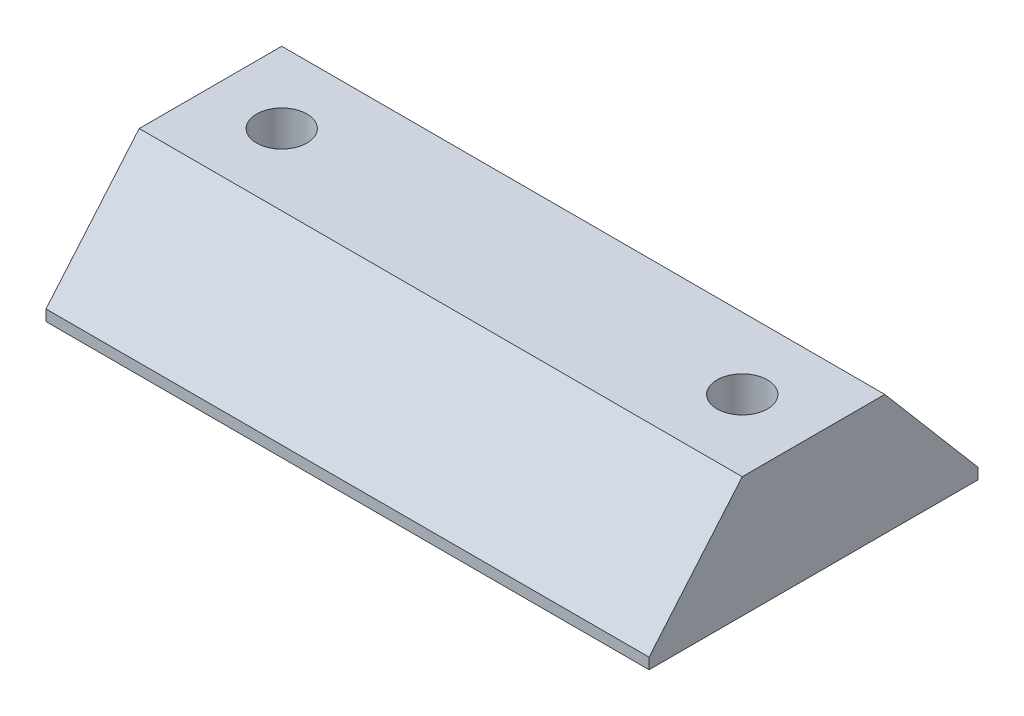
ISO-10303-21;
HEADER;
FILE_DESCRIPTION(('STEP AP214'),'2;1');
FILE_NAME('part.step','',(''),(''),'','','');
FILE_SCHEMA(('AUTOMOTIVE_DESIGN { 1 0 10303 214 1 1 1 1 }'));
ENDSEC;
DATA;
#1=APPLICATION_CONTEXT('core data for automotive mechanical design processes');
#2=APPLICATION_PROTOCOL_DEFINITION('international standard','automotive_design',2000,#1);
#3=PRODUCT_CONTEXT('',#1,'mechanical');
#4=PRODUCT('Part','Part','',(#3));
#5=PRODUCT_RELATED_PRODUCT_CATEGORY('part','',(#4));
#6=PRODUCT_DEFINITION_FORMATION('','',#4);
#7=PRODUCT_DEFINITION_CONTEXT('part definition',#1,'design');
#8=PRODUCT_DEFINITION('design','',#6,#7);
#9=PRODUCT_DEFINITION_SHAPE('','',#8);
#10=(LENGTH_UNIT() NAMED_UNIT(*) SI_UNIT(.MILLI.,.METRE.));
#11=(NAMED_UNIT(*) PLANE_ANGLE_UNIT() SI_UNIT($,.RADIAN.));
#12=(NAMED_UNIT(*) SI_UNIT($,.STERADIAN.) SOLID_ANGLE_UNIT());
#13=UNCERTAINTY_MEASURE_WITH_UNIT(LENGTH_MEASURE(1.E-05),#10,'distance_accuracy_value','');
#14=(GEOMETRIC_REPRESENTATION_CONTEXT(3) GLOBAL_UNCERTAINTY_ASSIGNED_CONTEXT((#13)) GLOBAL_UNIT_ASSIGNED_CONTEXT((#10,
#11,#12)) REPRESENTATION_CONTEXT('',''));
#15=CARTESIAN_POINT('',(0.,0.,0.));
#16=DIRECTION('',(0.,0.,1.));
#17=DIRECTION('',(1.,0.,0.));
#18=AXIS2_PLACEMENT_3D('',#15,#16,#17);
#19=CARTESIAN_POINT('',(0.,0.,0.));
#20=DIRECTION('',(0.,-1.,0.));
#21=DIRECTION('',(0.,0.,-1.));
#22=AXIS2_PLACEMENT_3D('',#19,#20,#21);
#23=PLANE('',#22);
#24=DIRECTION('',(0.,0.,1.));
#25=VECTOR('',#24,1.);
#26=CARTESIAN_POINT('',(0.,0.,0.));
#27=LINE('',#26,#25);
#28=CARTESIAN_POINT('',(0.,0.,-30.));
#29=VERTEX_POINT('',#28);
#30=CARTESIAN_POINT('',(0.,0.,0.));
#31=VERTEX_POINT('',#30);
#32=EDGE_CURVE('E148',#29,#31,#27,.T.);
#33=ORIENTED_EDGE('',*,*,#32,.F.);
#34=DIRECTION('',(-1.,0.,0.));
#35=VECTOR('',#34,1.);
#36=CARTESIAN_POINT('',(0.,0.,-30.));
#37=LINE('',#36,#35);
#38=CARTESIAN_POINT('',(55.,0.,-30.));
#39=VERTEX_POINT('',#38);
#40=EDGE_CURVE('E155',#39,#29,#37,.T.);
#41=ORIENTED_EDGE('',*,*,#40,.F.);
#42=DIRECTION('',(0.,0.,-1.));
#43=VECTOR('',#42,1.);
#44=CARTESIAN_POINT('',(55.,0.,0.));
#45=LINE('',#44,#43);
#46=CARTESIAN_POINT('',(55.,0.,0.));
#47=VERTEX_POINT('',#46);
#48=EDGE_CURVE('E164',#47,#39,#45,.T.);
#49=ORIENTED_EDGE('',*,*,#48,.F.);
#50=DIRECTION('',(1.,0.,0.));
#51=VECTOR('',#50,1.);
#52=CARTESIAN_POINT('',(0.,0.,0.));
#53=LINE('',#52,#51);
#54=EDGE_CURVE('E161',#31,#47,#53,.T.);
#55=ORIENTED_EDGE('',*,*,#54,.F.);
#56=EDGE_LOOP('',(#33,#41,#49,#55));
#57=FACE_BOUND('',#56,.T.);
#58=CARTESIAN_POINT('',(6.5,0.,-15.));
#59=DIRECTION('',(0.,-1.,0.));
#60=DIRECTION('',(0.,0.,-1.));
#61=AXIS2_PLACEMENT_3D('',#58,#59,#60);
#62=CIRCLE('',#61,2.3);
#63=CARTESIAN_POINT('',(6.5,0.,-17.3));
#64=VERTEX_POINT('',#63);
#65=EDGE_CURVE('E143',#64,#64,#62,.F.);
#66=ORIENTED_EDGE('',*,*,#65,.T.);
#67=EDGE_LOOP('',(#66));
#68=FACE_BOUND('',#67,.T.);
#69=CARTESIAN_POINT('',(48.5,0.,-15.));
#70=DIRECTION('',(0.,-1.,0.));
#71=DIRECTION('',(0.,0.,-1.));
#72=AXIS2_PLACEMENT_3D('',#69,#70,#71);
#73=CIRCLE('',#72,2.30000000000001);
#74=CARTESIAN_POINT('',(48.5,0.,-17.3));
#75=VERTEX_POINT('',#74);
#76=EDGE_CURVE('E134',#75,#75,#73,.F.);
#77=ORIENTED_EDGE('',*,*,#76,.T.);
#78=EDGE_LOOP('',(#77));
#79=FACE_BOUND('',#78,.T.);
#80=DIRECTION('',(1.,0.,0.));
#81=VECTOR('',#80,1.);
#82=CARTESIAN_POINT('',(16.5,0.,-18.05));
#83=LINE('',#82,#81);
#84=CARTESIAN_POINT('',(16.5,0.,-18.05));
#85=VERTEX_POINT('',#84);
#86=CARTESIAN_POINT('',(38.5,0.,-18.05));
#87=VERTEX_POINT('',#86);
#88=EDGE_CURVE('E354',#85,#87,#83,.T.);
#89=ORIENTED_EDGE('',*,*,#88,.F.);
#90=DIRECTION('',(0.,0.,-1.));
#91=VECTOR('',#90,1.);
#92=CARTESIAN_POINT('',(16.5,0.,-10.25));
#93=LINE('',#92,#91);
#94=CARTESIAN_POINT('',(16.5,0.,-10.25));
#95=VERTEX_POINT('',#94);
#96=EDGE_CURVE('E132',#95,#85,#93,.T.);
#97=ORIENTED_EDGE('',*,*,#96,.F.);
#98=DIRECTION('',(-1.,0.,0.));
#99=VECTOR('',#98,1.);
#100=CARTESIAN_POINT('',(16.5,0.,-10.25));
#101=LINE('',#100,#99);
#102=CARTESIAN_POINT('',(38.5,0.,-10.25));
#103=VERTEX_POINT('',#102);
#104=EDGE_CURVE('E128',#103,#95,#101,.T.);
#105=ORIENTED_EDGE('',*,*,#104,.F.);
#106=DIRECTION('',(0.,0.,1.));
#107=VECTOR('',#106,1.);
#108=CARTESIAN_POINT('',(38.5,0.,-10.25));
#109=LINE('',#108,#107);
#110=EDGE_CURVE('E351',#87,#103,#109,.T.);
#111=ORIENTED_EDGE('',*,*,#110,.F.);
#112=EDGE_LOOP('',(#89,#97,#105,#111));
#113=FACE_BOUND('',#112,.T.);
#114=ADVANCED_FACE('F33',(#57,#68,#79,#113),#23,.T.);
#115=CARTESIAN_POINT('',(0.,11.,0.));
#116=DIRECTION('',(1.,0.,0.));
#117=DIRECTION('',(0.,0.,-1.));
#118=AXIS2_PLACEMENT_3D('',#115,#116,#117);
#119=PLANE('',#118);
#120=DIRECTION('',(0.,0.,1.));
#121=VECTOR('',#120,1.);
#122=CARTESIAN_POINT('',(0.,11.,0.));
#123=LINE('',#122,#121);
#124=CARTESIAN_POINT('',(0.,11.,-21.5));
#125=VERTEX_POINT('',#124);
#126=CARTESIAN_POINT('',(0.,11.,-8.50000000000002));
#127=VERTEX_POINT('',#126);
#128=EDGE_CURVE('E151',#125,#127,#123,.T.);
#129=ORIENTED_EDGE('',*,*,#128,.F.);
#130=DIRECTION('',(0.,0.76193931775946,0.64764842009554));
#131=VECTOR('',#130,1.);
#132=CARTESIAN_POINT('',(0.,11.,-21.5));
#133=LINE('',#132,#131);
#134=CARTESIAN_POINT('',(0.,0.999999999999956,-30.));
#135=VERTEX_POINT('',#134);
#136=EDGE_CURVE('E184',#125,#135,#133,.F.);
#137=ORIENTED_EDGE('',*,*,#136,.T.);
#138=DIRECTION('',(0.,-1.,0.));
#139=VECTOR('',#138,1.);
#140=CARTESIAN_POINT('',(0.,11.,-30.));
#141=LINE('',#140,#139);
#142=EDGE_CURVE('E158',#135,#29,#141,.T.);
#143=ORIENTED_EDGE('',*,*,#142,.T.);
#144=ORIENTED_EDGE('',*,*,#32,.T.);
#145=DIRECTION('',(0.,-1.,0.));
#146=VECTOR('',#145,1.);
#147=CARTESIAN_POINT('',(0.,11.,0.));
#148=LINE('',#147,#146);
#149=CARTESIAN_POINT('',(0.,0.999999999999955,0.));
#150=VERTEX_POINT('',#149);
#151=EDGE_CURVE('E174',#150,#31,#148,.T.);
#152=ORIENTED_EDGE('',*,*,#151,.F.);
#153=DIRECTION('',(0.,-0.76193931775946,0.64764842009554));
#154=VECTOR('',#153,1.);
#155=CARTESIAN_POINT('',(0.,11.,-8.50000000000002));
#156=LINE('',#155,#154);
#157=EDGE_CURVE('E182',#150,#127,#156,.F.);
#158=ORIENTED_EDGE('',*,*,#157,.T.);
#159=EDGE_LOOP('',(#129,#137,#143,#144,#152,#158));
#160=FACE_BOUND('',#159,.T.);
#161=ADVANCED_FACE('F201',(#160),#119,.F.);
#162=CARTESIAN_POINT('',(0.,11.,0.));
#163=DIRECTION('',(0.,0.,-1.));
#164=DIRECTION('',(-1.,0.,0.));
#165=AXIS2_PLACEMENT_3D('',#162,#163,#164);
#166=PLANE('',#165);
#167=DIRECTION('',(0.,-1.,0.));
#168=VECTOR('',#167,1.);
#169=CARTESIAN_POINT('',(55.,11.,0.));
#170=LINE('',#169,#168);
#171=CARTESIAN_POINT('',(55.,0.999999999999956,0.));
#172=VERTEX_POINT('',#171);
#173=EDGE_CURVE('E172',#172,#47,#170,.T.);
#174=ORIENTED_EDGE('',*,*,#173,.F.);
#175=DIRECTION('',(-1.,0.,0.));
#176=VECTOR('',#175,1.);
#177=CARTESIAN_POINT('',(0.,0.999999999999956,0.));
#178=LINE('',#177,#176);
#179=EDGE_CURVE('E12',#172,#150,#178,.T.);
#180=ORIENTED_EDGE('',*,*,#179,.T.);
#181=ORIENTED_EDGE('',*,*,#151,.T.);
#182=ORIENTED_EDGE('',*,*,#54,.T.);
#183=EDGE_LOOP('',(#174,#180,#181,#182));
#184=FACE_BOUND('',#183,.T.);
#185=ADVANCED_FACE('F215',(#184),#166,.F.);
#186=CARTESIAN_POINT('',(55.,11.,0.));
#187=DIRECTION('',(-1.,0.,0.));
#188=DIRECTION('',(0.,0.,1.));
#189=AXIS2_PLACEMENT_3D('',#186,#187,#188);
#190=PLANE('',#189);
#191=DIRECTION('',(0.,-1.,0.));
#192=VECTOR('',#191,1.);
#193=CARTESIAN_POINT('',(55.,11.,-30.));
#194=LINE('',#193,#192);
#195=CARTESIAN_POINT('',(55.,0.999999999999955,-30.));
#196=VERTEX_POINT('',#195);
#197=EDGE_CURVE('E170',#196,#39,#194,.T.);
#198=ORIENTED_EDGE('',*,*,#197,.F.);
#199=DIRECTION('',(0.,-0.76193931775946,-0.64764842009554));
#200=VECTOR('',#199,1.);
#201=CARTESIAN_POINT('',(55.,11.,-21.5));
#202=LINE('',#201,#200);
#203=CARTESIAN_POINT('',(55.,11.,-21.5));
#204=VERTEX_POINT('',#203);
#205=EDGE_CURVE('E41',#196,#204,#202,.F.);
#206=ORIENTED_EDGE('',*,*,#205,.T.);
#207=DIRECTION('',(0.,0.,-1.));
#208=VECTOR('',#207,1.);
#209=CARTESIAN_POINT('',(55.,11.,0.));
#210=LINE('',#209,#208);
#211=CARTESIAN_POINT('',(55.,11.,-8.50000000000002));
#212=VERTEX_POINT('',#211);
#213=EDGE_CURVE('E154',#212,#204,#210,.T.);
#214=ORIENTED_EDGE('',*,*,#213,.F.);
#215=DIRECTION('',(0.,0.76193931775946,-0.64764842009554));
#216=VECTOR('',#215,1.);
#217=CARTESIAN_POINT('',(55.,11.,-8.50000000000002));
#218=LINE('',#217,#216);
#219=EDGE_CURVE('E56',#212,#172,#218,.F.);
#220=ORIENTED_EDGE('',*,*,#219,.T.);
#221=ORIENTED_EDGE('',*,*,#173,.T.);
#222=ORIENTED_EDGE('',*,*,#48,.T.);
#223=EDGE_LOOP('',(#198,#206,#214,#220,#221,#222));
#224=FACE_BOUND('',#223,.T.);
#225=ADVANCED_FACE('F190',(#224),#190,.F.);
#226=CARTESIAN_POINT('',(0.,11.,-30.));
#227=DIRECTION('',(0.,0.,1.));
#228=DIRECTION('',(1.,0.,0.));
#229=AXIS2_PLACEMENT_3D('',#226,#227,#228);
#230=PLANE('',#229);
#231=ORIENTED_EDGE('',*,*,#142,.F.);
#232=DIRECTION('',(1.,0.,0.));
#233=VECTOR('',#232,1.);
#234=CARTESIAN_POINT('',(0.,0.999999999999956,-30.));
#235=LINE('',#234,#233);
#236=EDGE_CURVE('E186',#135,#196,#235,.T.);
#237=ORIENTED_EDGE('',*,*,#236,.T.);
#238=ORIENTED_EDGE('',*,*,#197,.T.);
#239=ORIENTED_EDGE('',*,*,#40,.T.);
#240=EDGE_LOOP('',(#231,#237,#238,#239));
#241=FACE_BOUND('',#240,.T.);
#242=ADVANCED_FACE('F203',(#241),#230,.F.);
#243=CARTESIAN_POINT('',(0.,11.,0.));
#244=DIRECTION('',(0.,-1.,0.));
#245=DIRECTION('',(0.,0.,-1.));
#246=AXIS2_PLACEMENT_3D('',#243,#244,#245);
#247=PLANE('',#246);
#248=CARTESIAN_POINT('',(48.5,11.,-15.));
#249=DIRECTION('',(0.,1.,0.));
#250=DIRECTION('',(0.,0.,1.));
#251=AXIS2_PLACEMENT_3D('',#248,#249,#250);
#252=CIRCLE('',#251,2.30000000000001);
#253=CARTESIAN_POINT('',(48.5,11.,-12.7));
#254=VERTEX_POINT('',#253);
#255=EDGE_CURVE('E137',#254,#254,#252,.T.);
#256=ORIENTED_EDGE('',*,*,#255,.F.);
#257=EDGE_LOOP('',(#256));
#258=FACE_BOUND('',#257,.T.);
#259=CARTESIAN_POINT('',(6.5,11.,-15.));
#260=DIRECTION('',(0.,1.,0.));
#261=DIRECTION('',(0.,0.,1.));
#262=AXIS2_PLACEMENT_3D('',#259,#260,#261);
#263=CIRCLE('',#262,2.3);
#264=CARTESIAN_POINT('',(6.5,11.,-12.7));
#265=VERTEX_POINT('',#264);
#266=EDGE_CURVE('E145',#265,#265,#263,.T.);
#267=ORIENTED_EDGE('',*,*,#266,.F.);
#268=EDGE_LOOP('',(#267));
#269=FACE_BOUND('',#268,.T.);
#270=ORIENTED_EDGE('',*,*,#213,.T.);
#271=DIRECTION('',(-1.,0.,0.));
#272=VECTOR('',#271,1.);
#273=CARTESIAN_POINT('',(0.,11.,-21.5));
#274=LINE('',#273,#272);
#275=EDGE_CURVE('E179',#204,#125,#274,.T.);
#276=ORIENTED_EDGE('',*,*,#275,.T.);
#277=ORIENTED_EDGE('',*,*,#128,.T.);
#278=DIRECTION('',(1.,0.,0.));
#279=VECTOR('',#278,1.);
#280=CARTESIAN_POINT('',(0.,11.,-8.50000000000002));
#281=LINE('',#280,#279);
#282=EDGE_CURVE('E176',#127,#212,#281,.T.);
#283=ORIENTED_EDGE('',*,*,#282,.T.);
#284=EDGE_LOOP('',(#270,#276,#277,#283));
#285=FACE_BOUND('',#284,.T.);
#286=ADVANCED_FACE('F195',(#258,#269,#285),#247,.F.);
#287=CARTESIAN_POINT('',(0.,11.,-21.5));
#288=DIRECTION('',(0.,-0.64764842009554,0.76193931775946));
#289=DIRECTION('',(-1.,0.,0.));
#290=AXIS2_PLACEMENT_3D('',#287,#288,#289);
#291=PLANE('',#290);
#292=ORIENTED_EDGE('',*,*,#205,.F.);
#293=ORIENTED_EDGE('',*,*,#236,.F.);
#294=ORIENTED_EDGE('',*,*,#136,.F.);
#295=ORIENTED_EDGE('',*,*,#275,.F.);
#296=EDGE_LOOP('',(#292,#293,#294,#295));
#297=FACE_BOUND('',#296,.T.);
#298=ADVANCED_FACE('F198',(#297),#291,.F.);
#299=CARTESIAN_POINT('',(0.,11.,-8.50000000000002));
#300=DIRECTION('',(0.,-0.64764842009554,-0.76193931775946));
#301=DIRECTION('',(1.,0.,0.));
#302=AXIS2_PLACEMENT_3D('',#299,#300,#301);
#303=PLANE('',#302);
#304=ORIENTED_EDGE('',*,*,#157,.F.);
#305=ORIENTED_EDGE('',*,*,#179,.F.);
#306=ORIENTED_EDGE('',*,*,#219,.F.);
#307=ORIENTED_EDGE('',*,*,#282,.F.);
#308=EDGE_LOOP('',(#304,#305,#306,#307));
#309=FACE_BOUND('',#308,.T.);
#310=ADVANCED_FACE('F35',(#309),#303,.F.);
#311=CARTESIAN_POINT('',(6.5,-0.000999999999999265,-15.));
#312=DIRECTION('',(0.,1.,0.));
#313=DIRECTION('',(0.,0.,1.));
#314=AXIS2_PLACEMENT_3D('',#311,#312,#313);
#315=CYLINDRICAL_SURFACE('',#314,2.3);
#316=ORIENTED_EDGE('',*,*,#65,.F.);
#317=EDGE_LOOP('',(#316));
#318=FACE_BOUND('',#317,.T.);
#319=ORIENTED_EDGE('',*,*,#266,.T.);
#320=EDGE_LOOP('',(#319));
#321=FACE_BOUND('',#320,.T.);
#322=ADVANCED_FACE('F243',(#318,#321),#315,.F.);
#323=CARTESIAN_POINT('',(48.5,-0.000999999999999265,-15.));
#324=DIRECTION('',(0.,1.,0.));
#325=DIRECTION('',(0.,0.,1.));
#326=AXIS2_PLACEMENT_3D('',#323,#324,#325);
#327=CYLINDRICAL_SURFACE('',#326,2.30000000000001);
#328=ORIENTED_EDGE('',*,*,#76,.F.);
#329=EDGE_LOOP('',(#328));
#330=FACE_BOUND('',#329,.T.);
#331=ORIENTED_EDGE('',*,*,#255,.T.);
#332=EDGE_LOOP('',(#331));
#333=FACE_BOUND('',#332,.T.);
#334=ADVANCED_FACE('F245',(#330,#333),#327,.F.);
#335=CARTESIAN_POINT('',(16.5,-3.,-10.25));
#336=DIRECTION('',(1.,0.,0.));
#337=DIRECTION('',(0.,0.,-1.));
#338=AXIS2_PLACEMENT_3D('',#335,#336,#337);
#339=PLANE('',#338);
#340=ORIENTED_EDGE('',*,*,#96,.T.);
#341=DIRECTION('',(0.,1.,0.));
#342=VECTOR('',#341,1.);
#343=CARTESIAN_POINT('',(16.5,-3.,-18.05));
#344=LINE('',#343,#342);
#345=CARTESIAN_POINT('',(16.5,-3.,-18.05));
#346=VERTEX_POINT('',#345);
#347=EDGE_CURVE('E113',#346,#85,#344,.T.);
#348=ORIENTED_EDGE('',*,*,#347,.F.);
#349=DIRECTION('',(0.,0.,-1.));
#350=VECTOR('',#349,1.);
#351=CARTESIAN_POINT('',(16.5,-3.,-10.25));
#352=LINE('',#351,#350);
#353=CARTESIAN_POINT('',(16.5,-3.,-10.25));
#354=VERTEX_POINT('',#353);
#355=EDGE_CURVE('E120',#354,#346,#352,.T.);
#356=ORIENTED_EDGE('',*,*,#355,.F.);
#357=DIRECTION('',(0.,1.,0.));
#358=VECTOR('',#357,1.);
#359=CARTESIAN_POINT('',(16.5,-3.,-10.25));
#360=LINE('',#359,#358);
#361=EDGE_CURVE('E348',#354,#95,#360,.T.);
#362=ORIENTED_EDGE('',*,*,#361,.T.);
#363=EDGE_LOOP('',(#340,#348,#356,#362));
#364=FACE_BOUND('',#363,.T.);
#365=ADVANCED_FACE('F130',(#364),#339,.F.);
#366=CARTESIAN_POINT('',(16.5,-3.,-18.05));
#367=DIRECTION('',(0.,0.,1.));
#368=DIRECTION('',(1.,0.,0.));
#369=AXIS2_PLACEMENT_3D('',#366,#367,#368);
#370=PLANE('',#369);
#371=ORIENTED_EDGE('',*,*,#88,.T.);
#372=DIRECTION('',(0.,1.,0.));
#373=VECTOR('',#372,1.);
#374=CARTESIAN_POINT('',(38.5,-3.,-18.05));
#375=LINE('',#374,#373);
#376=CARTESIAN_POINT('',(38.5,-3.,-18.05));
#377=VERTEX_POINT('',#376);
#378=EDGE_CURVE('E116',#377,#87,#375,.T.);
#379=ORIENTED_EDGE('',*,*,#378,.F.);
#380=DIRECTION('',(1.,0.,0.));
#381=VECTOR('',#380,1.);
#382=CARTESIAN_POINT('',(16.5,-3.,-18.05));
#383=LINE('',#382,#381);
#384=EDGE_CURVE('E109',#346,#377,#383,.T.);
#385=ORIENTED_EDGE('',*,*,#384,.F.);
#386=ORIENTED_EDGE('',*,*,#347,.T.);
#387=EDGE_LOOP('',(#371,#379,#385,#386));
#388=FACE_BOUND('',#387,.T.);
#389=ADVANCED_FACE('F111',(#388),#370,.F.);
#390=CARTESIAN_POINT('',(38.5,-3.,-10.25));
#391=DIRECTION('',(-1.,0.,0.));
#392=DIRECTION('',(0.,0.,1.));
#393=AXIS2_PLACEMENT_3D('',#390,#391,#392);
#394=PLANE('',#393);
#395=ORIENTED_EDGE('',*,*,#110,.T.);
#396=DIRECTION('',(0.,1.,0.));
#397=VECTOR('',#396,1.);
#398=CARTESIAN_POINT('',(38.5,-3.,-10.25));
#399=LINE('',#398,#397);
#400=CARTESIAN_POINT('',(38.5,-3.,-10.25));
#401=VERTEX_POINT('',#400);
#402=EDGE_CURVE('E48',#401,#103,#399,.T.);
#403=ORIENTED_EDGE('',*,*,#402,.F.);
#404=DIRECTION('',(0.,0.,1.));
#405=VECTOR('',#404,1.);
#406=CARTESIAN_POINT('',(38.5,-3.,-10.25));
#407=LINE('',#406,#405);
#408=EDGE_CURVE('E119',#377,#401,#407,.T.);
#409=ORIENTED_EDGE('',*,*,#408,.F.);
#410=ORIENTED_EDGE('',*,*,#378,.T.);
#411=EDGE_LOOP('',(#395,#403,#409,#410));
#412=FACE_BOUND('',#411,.T.);
#413=ADVANCED_FACE('F259',(#412),#394,.F.);
#414=CARTESIAN_POINT('',(16.5,-3.,-10.25));
#415=DIRECTION('',(0.,0.,-1.));
#416=DIRECTION('',(-1.,0.,0.));
#417=AXIS2_PLACEMENT_3D('',#414,#415,#416);
#418=PLANE('',#417);
#419=ORIENTED_EDGE('',*,*,#104,.T.);
#420=ORIENTED_EDGE('',*,*,#361,.F.);
#421=DIRECTION('',(-1.,0.,0.));
#422=VECTOR('',#421,1.);
#423=CARTESIAN_POINT('',(16.5,-3.,-10.25));
#424=LINE('',#423,#422);
#425=EDGE_CURVE('E124',#401,#354,#424,.T.);
#426=ORIENTED_EDGE('',*,*,#425,.F.);
#427=ORIENTED_EDGE('',*,*,#402,.T.);
#428=EDGE_LOOP('',(#419,#420,#426,#427));
#429=FACE_BOUND('',#428,.T.);
#430=ADVANCED_FACE('F262',(#429),#418,.F.);
#431=CARTESIAN_POINT('',(0.,-3.,0.));
#432=DIRECTION('',(0.,-1.,0.));
#433=DIRECTION('',(0.,0.,-1.));
#434=AXIS2_PLACEMENT_3D('',#431,#432,#433);
#435=PLANE('',#434);
#436=ORIENTED_EDGE('',*,*,#355,.T.);
#437=ORIENTED_EDGE('',*,*,#384,.T.);
#438=ORIENTED_EDGE('',*,*,#408,.T.);
#439=ORIENTED_EDGE('',*,*,#425,.T.);
#440=EDGE_LOOP('',(#436,#437,#438,#439));
#441=FACE_BOUND('',#440,.T.);
#442=ADVANCED_FACE('F123',(#441),#435,.T.);
#443=CLOSED_SHELL('',(#114,#161,#185,#225,#242,#286,#298,#310,#322,#334,#365,#389,#413,#430,#442));
#444=MANIFOLD_SOLID_BREP('B2',#443);
#445=ADVANCED_BREP_SHAPE_REPRESENTATION('',(#18,#444),#14);
#446=SHAPE_DEFINITION_REPRESENTATION(#9,#445);
ENDSEC;
END-ISO-10303-21;
